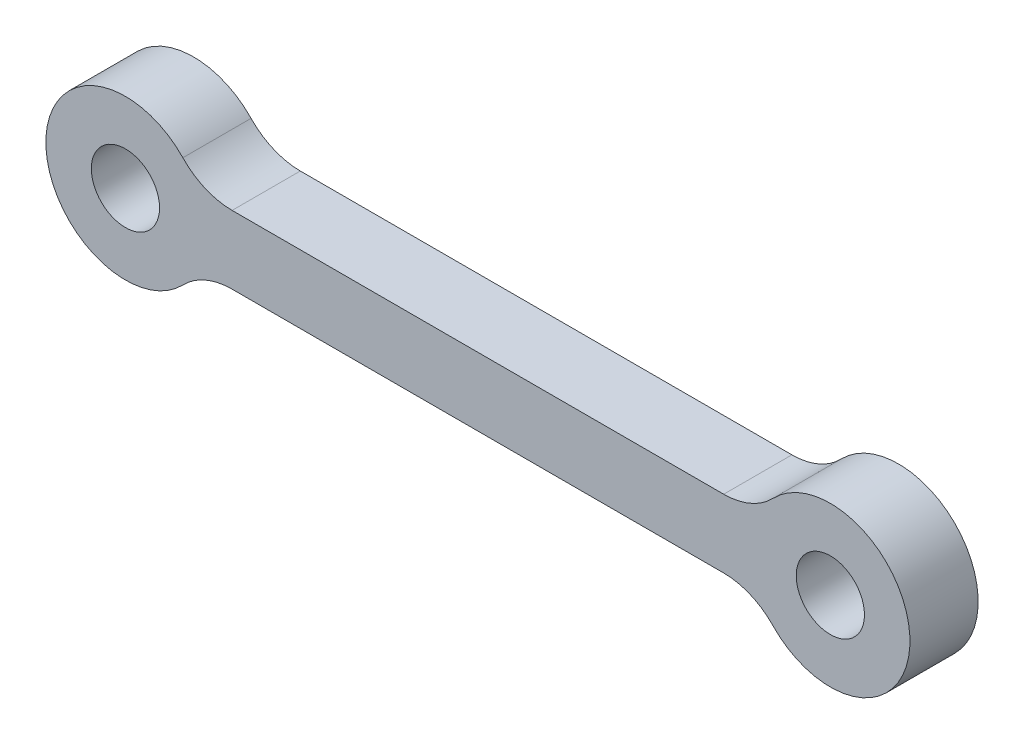
ISO-10303-21;
HEADER;
FILE_DESCRIPTION(('STEP AP214'),'2;1');
FILE_NAME('part.step','',(''),(''),'','','');
FILE_SCHEMA(('AUTOMOTIVE_DESIGN { 1 0 10303 214 1 1 1 1 }'));
ENDSEC;
DATA;
#1=APPLICATION_CONTEXT('core data for automotive mechanical design processes');
#2=APPLICATION_PROTOCOL_DEFINITION('international standard','automotive_design',2000,#1);
#3=PRODUCT_CONTEXT('',#1,'mechanical');
#4=PRODUCT('Part','Part','',(#3));
#5=PRODUCT_RELATED_PRODUCT_CATEGORY('part','',(#4));
#6=PRODUCT_DEFINITION_FORMATION('','',#4);
#7=PRODUCT_DEFINITION_CONTEXT('part definition',#1,'design');
#8=PRODUCT_DEFINITION('design','',#6,#7);
#9=PRODUCT_DEFINITION_SHAPE('','',#8);
#10=(LENGTH_UNIT() NAMED_UNIT(*) SI_UNIT(.MILLI.,.METRE.));
#11=(NAMED_UNIT(*) PLANE_ANGLE_UNIT() SI_UNIT($,.RADIAN.));
#12=(NAMED_UNIT(*) SI_UNIT($,.STERADIAN.) SOLID_ANGLE_UNIT());
#13=UNCERTAINTY_MEASURE_WITH_UNIT(LENGTH_MEASURE(1.E-05),#10,'distance_accuracy_value','');
#14=(GEOMETRIC_REPRESENTATION_CONTEXT(3) GLOBAL_UNCERTAINTY_ASSIGNED_CONTEXT((#13)) GLOBAL_UNIT_ASSIGNED_CONTEXT((#10,
#11,#12)) REPRESENTATION_CONTEXT('',''));
#15=CARTESIAN_POINT('',(0.,0.,0.));
#16=DIRECTION('',(0.,0.,1.));
#17=DIRECTION('',(1.,0.,0.));
#18=AXIS2_PLACEMENT_3D('',#15,#16,#17);
#19=CARTESIAN_POINT('',(26.3095842401766,-4.5,3.));
#20=DIRECTION('',(0.,0.,-1.));
#21=DIRECTION('',(-1.,0.,0.));
#22=AXIS2_PLACEMENT_3D('',#19,#20,#21);
#23=PLANE('',#22);
#24=CARTESIAN_POINT('',(26.3095842401766,-4.5,3.));
#25=DIRECTION('',(0.,0.,-1.));
#26=DIRECTION('',(-1.,0.,0.));
#27=AXIS2_PLACEMENT_3D('',#24,#25,#26);
#28=CIRCLE('',#27,3.);
#29=CARTESIAN_POINT('',(26.3095842401766,-1.5,3.));
#30=VERTEX_POINT('',#29);
#31=CARTESIAN_POINT('',(28.4743915139412,-2.42307692307692,3.));
#32=VERTEX_POINT('',#31);
#33=EDGE_CURVE('E147',#30,#32,#28,.T.);
#34=ORIENTED_EDGE('',*,*,#33,.T.);
#35=CARTESIAN_POINT('',(31.,0.,3.));
#36=DIRECTION('',(0.,0.,1.));
#37=DIRECTION('',(1.,0.,0.));
#38=AXIS2_PLACEMENT_3D('',#35,#36,#37);
#39=CIRCLE('',#38,3.5);
#40=CARTESIAN_POINT('',(28.4743915139412,2.42307692307692,3.));
#41=VERTEX_POINT('',#40);
#42=EDGE_CURVE('E95',#32,#41,#39,.T.);
#43=ORIENTED_EDGE('',*,*,#42,.T.);
#44=CARTESIAN_POINT('',(26.3095842401766,4.5,3.));
#45=DIRECTION('',(0.,0.,-1.));
#46=DIRECTION('',(1.,0.,0.));
#47=AXIS2_PLACEMENT_3D('',#44,#45,#46);
#48=CIRCLE('',#47,3.);
#49=CARTESIAN_POINT('',(26.3095842401766,1.5,3.));
#50=VERTEX_POINT('',#49);
#51=EDGE_CURVE('E162',#41,#50,#48,.T.);
#52=ORIENTED_EDGE('',*,*,#51,.T.);
#53=DIRECTION('',(-1.,0.,0.));
#54=VECTOR('',#53,1.);
#55=CARTESIAN_POINT('',(4.69041575982343,1.5,3.));
#56=LINE('',#55,#54);
#57=CARTESIAN_POINT('',(4.69041575982343,1.5,3.));
#58=VERTEX_POINT('',#57);
#59=EDGE_CURVE('E175',#50,#58,#56,.T.);
#60=ORIENTED_EDGE('',*,*,#59,.T.);
#61=CARTESIAN_POINT('',(4.69041575982343,4.5,3.));
#62=DIRECTION('',(0.,0.,-1.));
#63=DIRECTION('',(-1.,0.,0.));
#64=AXIS2_PLACEMENT_3D('',#61,#62,#63);
#65=CIRCLE('',#64,3.);
#66=CARTESIAN_POINT('',(2.52560848605877,2.42307692307692,3.));
#67=VERTEX_POINT('',#66);
#68=EDGE_CURVE('E114',#58,#67,#65,.T.);
#69=ORIENTED_EDGE('',*,*,#68,.T.);
#70=CARTESIAN_POINT('',(0.,0.,3.));
#71=DIRECTION('',(0.,0.,1.));
#72=DIRECTION('',(1.,0.,0.));
#73=AXIS2_PLACEMENT_3D('',#70,#71,#72);
#74=CIRCLE('',#73,3.5);
#75=CARTESIAN_POINT('',(2.52560848605877,-2.42307692307692,3.));
#76=VERTEX_POINT('',#75);
#77=EDGE_CURVE('E108',#67,#76,#74,.T.);
#78=ORIENTED_EDGE('',*,*,#77,.T.);
#79=CARTESIAN_POINT('',(4.69041575982343,-4.5,3.));
#80=DIRECTION('',(0.,0.,-1.));
#81=DIRECTION('',(1.,0.,0.));
#82=AXIS2_PLACEMENT_3D('',#79,#80,#81);
#83=CIRCLE('',#82,3.);
#84=CARTESIAN_POINT('',(4.69041575982343,-1.5,3.));
#85=VERTEX_POINT('',#84);
#86=EDGE_CURVE('E112',#76,#85,#83,.T.);
#87=ORIENTED_EDGE('',*,*,#86,.T.);
#88=DIRECTION('',(1.,0.,0.));
#89=VECTOR('',#88,1.);
#90=CARTESIAN_POINT('',(4.69041575982343,-1.5,3.));
#91=LINE('',#90,#89);
#92=EDGE_CURVE('E52',#85,#30,#91,.T.);
#93=ORIENTED_EDGE('',*,*,#92,.T.);
#94=EDGE_LOOP('',(#34,#43,#52,#60,#69,#78,#87,#93));
#95=FACE_BOUND('',#94,.T.);
#96=CARTESIAN_POINT('',(0.,0.,3.));
#97=DIRECTION('',(0.,0.,1.));
#98=DIRECTION('',(1.,0.,0.));
#99=AXIS2_PLACEMENT_3D('',#96,#97,#98);
#100=CIRCLE('',#99,1.5);
#101=CARTESIAN_POINT('',(1.5,0.,3.));
#102=VERTEX_POINT('',#101);
#103=EDGE_CURVE('E136',#102,#102,#100,.T.);
#104=ORIENTED_EDGE('',*,*,#103,.F.);
#105=EDGE_LOOP('',(#104));
#106=FACE_BOUND('',#105,.T.);
#107=CARTESIAN_POINT('',(31.,0.,3.));
#108=DIRECTION('',(0.,0.,1.));
#109=DIRECTION('',(1.,0.,0.));
#110=AXIS2_PLACEMENT_3D('',#107,#108,#109);
#111=CIRCLE('',#110,1.5);
#112=CARTESIAN_POINT('',(32.5,0.,3.));
#113=VERTEX_POINT('',#112);
#114=EDGE_CURVE('E184',#113,#113,#111,.T.);
#115=ORIENTED_EDGE('',*,*,#114,.F.);
#116=EDGE_LOOP('',(#115));
#117=FACE_BOUND('',#116,.T.);
#118=ADVANCED_FACE('F35',(#95,#106,#117),#23,.F.);
#119=CARTESIAN_POINT('',(26.3095842401766,-4.5,0.));
#120=DIRECTION('',(0.,0.,-1.));
#121=DIRECTION('',(-1.,0.,0.));
#122=AXIS2_PLACEMENT_3D('',#119,#120,#121);
#123=PLANE('',#122);
#124=CARTESIAN_POINT('',(0.,0.,0.));
#125=DIRECTION('',(0.,0.,1.));
#126=DIRECTION('',(1.,0.,0.));
#127=AXIS2_PLACEMENT_3D('',#124,#125,#126);
#128=CIRCLE('',#127,1.5);
#129=CARTESIAN_POINT('',(1.5,0.,0.));
#130=VERTEX_POINT('',#129);
#131=EDGE_CURVE('E181',#130,#130,#128,.T.);
#132=ORIENTED_EDGE('',*,*,#131,.T.);
#133=EDGE_LOOP('',(#132));
#134=FACE_BOUND('',#133,.T.);
#135=CARTESIAN_POINT('',(26.3095842401766,-4.5,0.));
#136=DIRECTION('',(0.,0.,-1.));
#137=DIRECTION('',(-1.,0.,0.));
#138=AXIS2_PLACEMENT_3D('',#135,#136,#137);
#139=CIRCLE('',#138,3.);
#140=CARTESIAN_POINT('',(26.3095842401766,-1.5,0.));
#141=VERTEX_POINT('',#140);
#142=CARTESIAN_POINT('',(28.4743915139412,-2.42307692307692,0.));
#143=VERTEX_POINT('',#142);
#144=EDGE_CURVE('E132',#141,#143,#139,.T.);
#145=ORIENTED_EDGE('',*,*,#144,.F.);
#146=DIRECTION('',(1.,0.,0.));
#147=VECTOR('',#146,1.);
#148=CARTESIAN_POINT('',(4.69041575982343,-1.5,0.));
#149=LINE('',#148,#147);
#150=CARTESIAN_POINT('',(4.69041575982343,-1.5,0.));
#151=VERTEX_POINT('',#150);
#152=EDGE_CURVE('E87',#151,#141,#149,.T.);
#153=ORIENTED_EDGE('',*,*,#152,.F.);
#154=CARTESIAN_POINT('',(4.69041575982343,-4.5,0.));
#155=DIRECTION('',(0.,0.,-1.));
#156=DIRECTION('',(1.,0.,0.));
#157=AXIS2_PLACEMENT_3D('',#154,#155,#156);
#158=CIRCLE('',#157,3.);
#159=CARTESIAN_POINT('',(2.52560848605877,-2.42307692307692,0.));
#160=VERTEX_POINT('',#159);
#161=EDGE_CURVE('E81',#160,#151,#158,.T.);
#162=ORIENTED_EDGE('',*,*,#161,.F.);
#163=CARTESIAN_POINT('',(0.,0.,0.));
#164=DIRECTION('',(0.,0.,1.));
#165=DIRECTION('',(1.,0.,0.));
#166=AXIS2_PLACEMENT_3D('',#163,#164,#165);
#167=CIRCLE('',#166,3.5);
#168=CARTESIAN_POINT('',(2.52560848605877,2.42307692307692,0.));
#169=VERTEX_POINT('',#168);
#170=EDGE_CURVE('E122',#169,#160,#167,.T.);
#171=ORIENTED_EDGE('',*,*,#170,.F.);
#172=CARTESIAN_POINT('',(4.69041575982343,4.5,0.));
#173=DIRECTION('',(0.,0.,-1.));
#174=DIRECTION('',(-1.,0.,0.));
#175=AXIS2_PLACEMENT_3D('',#172,#173,#174);
#176=CIRCLE('',#175,3.);
#177=CARTESIAN_POINT('',(4.69041575982343,1.5,0.));
#178=VERTEX_POINT('',#177);
#179=EDGE_CURVE('E142',#178,#169,#176,.T.);
#180=ORIENTED_EDGE('',*,*,#179,.F.);
#181=DIRECTION('',(-1.,0.,0.));
#182=VECTOR('',#181,1.);
#183=CARTESIAN_POINT('',(4.69041575982343,1.5,0.));
#184=LINE('',#183,#182);
#185=CARTESIAN_POINT('',(26.3095842401766,1.5,0.));
#186=VERTEX_POINT('',#185);
#187=EDGE_CURVE('E140',#186,#178,#184,.T.);
#188=ORIENTED_EDGE('',*,*,#187,.F.);
#189=CARTESIAN_POINT('',(26.3095842401766,4.5,0.));
#190=DIRECTION('',(0.,0.,-1.));
#191=DIRECTION('',(1.,0.,0.));
#192=AXIS2_PLACEMENT_3D('',#189,#190,#191);
#193=CIRCLE('',#192,3.);
#194=CARTESIAN_POINT('',(28.4743915139412,2.42307692307692,0.));
#195=VERTEX_POINT('',#194);
#196=EDGE_CURVE('E138',#195,#186,#193,.T.);
#197=ORIENTED_EDGE('',*,*,#196,.F.);
#198=CARTESIAN_POINT('',(31.,0.,0.));
#199=DIRECTION('',(0.,0.,1.));
#200=DIRECTION('',(1.,0.,0.));
#201=AXIS2_PLACEMENT_3D('',#198,#199,#200);
#202=CIRCLE('',#201,3.5);
#203=EDGE_CURVE('E135',#143,#195,#202,.T.);
#204=ORIENTED_EDGE('',*,*,#203,.F.);
#205=EDGE_LOOP('',(#145,#153,#162,#171,#180,#188,#197,#204));
#206=FACE_BOUND('',#205,.T.);
#207=CARTESIAN_POINT('',(31.,0.,0.));
#208=DIRECTION('',(0.,0.,1.));
#209=DIRECTION('',(1.,0.,0.));
#210=AXIS2_PLACEMENT_3D('',#207,#208,#209);
#211=CIRCLE('',#210,1.5);
#212=CARTESIAN_POINT('',(32.5,0.,0.));
#213=VERTEX_POINT('',#212);
#214=EDGE_CURVE('E187',#213,#213,#211,.T.);
#215=ORIENTED_EDGE('',*,*,#214,.T.);
#216=EDGE_LOOP('',(#215));
#217=FACE_BOUND('',#216,.T.);
#218=ADVANCED_FACE('F166',(#134,#206,#217),#123,.T.);
#219=CARTESIAN_POINT('',(26.3095842401766,-4.5,3.));
#220=DIRECTION('',(0.,0.,-1.));
#221=DIRECTION('',(-1.,0.,0.));
#222=AXIS2_PLACEMENT_3D('',#219,#220,#221);
#223=CYLINDRICAL_SURFACE('',#222,3.);
#224=ORIENTED_EDGE('',*,*,#144,.T.);
#225=DIRECTION('',(0.,0.,-1.));
#226=VECTOR('',#225,1.);
#227=CARTESIAN_POINT('',(28.4743915139412,-2.42307692307692,3.));
#228=LINE('',#227,#226);
#229=EDGE_CURVE('E11',#32,#143,#228,.T.);
#230=ORIENTED_EDGE('',*,*,#229,.F.);
#231=ORIENTED_EDGE('',*,*,#33,.F.);
#232=DIRECTION('',(0.,0.,-1.));
#233=VECTOR('',#232,1.);
#234=CARTESIAN_POINT('',(26.3095842401766,-1.5,3.));
#235=LINE('',#234,#233);
#236=EDGE_CURVE('E128',#30,#141,#235,.T.);
#237=ORIENTED_EDGE('',*,*,#236,.T.);
#238=EDGE_LOOP('',(#224,#230,#231,#237));
#239=FACE_BOUND('',#238,.T.);
#240=ADVANCED_FACE('F37',(#239),#223,.F.);
#241=CARTESIAN_POINT('',(31.,0.,3.));
#242=DIRECTION('',(0.,0.,-1.));
#243=DIRECTION('',(-1.,0.,0.));
#244=AXIS2_PLACEMENT_3D('',#241,#242,#243);
#245=CYLINDRICAL_SURFACE('',#244,3.5);
#246=ORIENTED_EDGE('',*,*,#203,.T.);
#247=DIRECTION('',(0.,0.,-1.));
#248=VECTOR('',#247,1.);
#249=CARTESIAN_POINT('',(28.4743915139412,2.42307692307692,3.));
#250=LINE('',#249,#248);
#251=EDGE_CURVE('E44',#41,#195,#250,.T.);
#252=ORIENTED_EDGE('',*,*,#251,.F.);
#253=ORIENTED_EDGE('',*,*,#42,.F.);
#254=ORIENTED_EDGE('',*,*,#229,.T.);
#255=EDGE_LOOP('',(#246,#252,#253,#254));
#256=FACE_BOUND('',#255,.T.);
#257=ADVANCED_FACE('F219',(#256),#245,.T.);
#258=CARTESIAN_POINT('',(26.3095842401766,4.5,3.));
#259=DIRECTION('',(0.,0.,-1.));
#260=DIRECTION('',(-1.,0.,0.));
#261=AXIS2_PLACEMENT_3D('',#258,#259,#260);
#262=CYLINDRICAL_SURFACE('',#261,3.);
#263=ORIENTED_EDGE('',*,*,#196,.T.);
#264=DIRECTION('',(0.,0.,-1.));
#265=VECTOR('',#264,1.);
#266=CARTESIAN_POINT('',(26.3095842401766,1.5,3.));
#267=LINE('',#266,#265);
#268=EDGE_CURVE('E154',#50,#186,#267,.T.);
#269=ORIENTED_EDGE('',*,*,#268,.F.);
#270=ORIENTED_EDGE('',*,*,#51,.F.);
#271=ORIENTED_EDGE('',*,*,#251,.T.);
#272=EDGE_LOOP('',(#263,#269,#270,#271));
#273=FACE_BOUND('',#272,.T.);
#274=ADVANCED_FACE('F160',(#273),#262,.F.);
#275=CARTESIAN_POINT('',(4.69041575982343,1.5,3.));
#276=DIRECTION('',(0.,-1.,0.));
#277=DIRECTION('',(0.,0.,-1.));
#278=AXIS2_PLACEMENT_3D('',#275,#276,#277);
#279=PLANE('',#278);
#280=ORIENTED_EDGE('',*,*,#187,.T.);
#281=DIRECTION('',(0.,0.,-1.));
#282=VECTOR('',#281,1.);
#283=CARTESIAN_POINT('',(4.69041575982343,1.5,3.));
#284=LINE('',#283,#282);
#285=EDGE_CURVE('E151',#58,#178,#284,.T.);
#286=ORIENTED_EDGE('',*,*,#285,.F.);
#287=ORIENTED_EDGE('',*,*,#59,.F.);
#288=ORIENTED_EDGE('',*,*,#268,.T.);
#289=EDGE_LOOP('',(#280,#286,#287,#288));
#290=FACE_BOUND('',#289,.T.);
#291=ADVANCED_FACE('F171',(#290),#279,.F.);
#292=CARTESIAN_POINT('',(4.69041575982343,4.5,3.));
#293=DIRECTION('',(0.,0.,-1.));
#294=DIRECTION('',(-1.,0.,0.));
#295=AXIS2_PLACEMENT_3D('',#292,#293,#294);
#296=CYLINDRICAL_SURFACE('',#295,3.);
#297=ORIENTED_EDGE('',*,*,#179,.T.);
#298=DIRECTION('',(0.,0.,-1.));
#299=VECTOR('',#298,1.);
#300=CARTESIAN_POINT('',(2.52560848605877,2.42307692307692,3.));
#301=LINE('',#300,#299);
#302=EDGE_CURVE('E123',#67,#169,#301,.T.);
#303=ORIENTED_EDGE('',*,*,#302,.F.);
#304=ORIENTED_EDGE('',*,*,#68,.F.);
#305=ORIENTED_EDGE('',*,*,#285,.T.);
#306=EDGE_LOOP('',(#297,#303,#304,#305));
#307=FACE_BOUND('',#306,.T.);
#308=ADVANCED_FACE('F174',(#307),#296,.F.);
#309=CARTESIAN_POINT('',(0.,0.,3.));
#310=DIRECTION('',(0.,0.,-1.));
#311=DIRECTION('',(-1.,0.,0.));
#312=AXIS2_PLACEMENT_3D('',#309,#310,#311);
#313=CYLINDRICAL_SURFACE('',#312,3.5);
#314=ORIENTED_EDGE('',*,*,#170,.T.);
#315=DIRECTION('',(0.,0.,-1.));
#316=VECTOR('',#315,1.);
#317=CARTESIAN_POINT('',(2.52560848605877,-2.42307692307692,3.));
#318=LINE('',#317,#316);
#319=EDGE_CURVE('E119',#76,#160,#318,.T.);
#320=ORIENTED_EDGE('',*,*,#319,.F.);
#321=ORIENTED_EDGE('',*,*,#77,.F.);
#322=ORIENTED_EDGE('',*,*,#302,.T.);
#323=EDGE_LOOP('',(#314,#320,#321,#322));
#324=FACE_BOUND('',#323,.T.);
#325=ADVANCED_FACE('F120',(#324),#313,.T.);
#326=CARTESIAN_POINT('',(4.69041575982343,-4.5,3.));
#327=DIRECTION('',(0.,0.,-1.));
#328=DIRECTION('',(-1.,0.,0.));
#329=AXIS2_PLACEMENT_3D('',#326,#327,#328);
#330=CYLINDRICAL_SURFACE('',#329,3.);
#331=ORIENTED_EDGE('',*,*,#161,.T.);
#332=DIRECTION('',(0.,0.,-1.));
#333=VECTOR('',#332,1.);
#334=CARTESIAN_POINT('',(4.69041575982343,-1.5,3.));
#335=LINE('',#334,#333);
#336=EDGE_CURVE('E124',#85,#151,#335,.T.);
#337=ORIENTED_EDGE('',*,*,#336,.F.);
#338=ORIENTED_EDGE('',*,*,#86,.F.);
#339=ORIENTED_EDGE('',*,*,#319,.T.);
#340=EDGE_LOOP('',(#331,#337,#338,#339));
#341=FACE_BOUND('',#340,.T.);
#342=ADVANCED_FACE('F126',(#341),#330,.F.);
#343=CARTESIAN_POINT('',(4.69041575982343,-1.5,3.));
#344=DIRECTION('',(0.,1.,0.));
#345=DIRECTION('',(0.,0.,1.));
#346=AXIS2_PLACEMENT_3D('',#343,#344,#345);
#347=PLANE('',#346);
#348=ORIENTED_EDGE('',*,*,#152,.T.);
#349=ORIENTED_EDGE('',*,*,#236,.F.);
#350=ORIENTED_EDGE('',*,*,#92,.F.);
#351=ORIENTED_EDGE('',*,*,#336,.T.);
#352=EDGE_LOOP('',(#348,#349,#350,#351));
#353=FACE_BOUND('',#352,.T.);
#354=ADVANCED_FACE('F207',(#353),#347,.F.);
#355=CARTESIAN_POINT('',(0.,0.,3.));
#356=DIRECTION('',(0.,0.,-1.));
#357=DIRECTION('',(-1.,0.,0.));
#358=AXIS2_PLACEMENT_3D('',#355,#356,#357);
#359=CYLINDRICAL_SURFACE('',#358,1.5);
#360=ORIENTED_EDGE('',*,*,#103,.T.);
#361=EDGE_LOOP('',(#360));
#362=FACE_BOUND('',#361,.T.);
#363=ORIENTED_EDGE('',*,*,#131,.F.);
#364=EDGE_LOOP('',(#363));
#365=FACE_BOUND('',#364,.T.);
#366=ADVANCED_FACE('F204',(#362,#365),#359,.F.);
#367=CARTESIAN_POINT('',(31.,0.,3.));
#368=DIRECTION('',(0.,0.,-1.));
#369=DIRECTION('',(-1.,0.,0.));
#370=AXIS2_PLACEMENT_3D('',#367,#368,#369);
#371=CYLINDRICAL_SURFACE('',#370,1.5);
#372=ORIENTED_EDGE('',*,*,#114,.T.);
#373=EDGE_LOOP('',(#372));
#374=FACE_BOUND('',#373,.T.);
#375=ORIENTED_EDGE('',*,*,#214,.F.);
#376=EDGE_LOOP('',(#375));
#377=FACE_BOUND('',#376,.T.);
#378=ADVANCED_FACE('F193',(#374,#377),#371,.F.);
#379=CLOSED_SHELL('',(#118,#218,#240,#257,#274,#291,#308,#325,#342,#354,#366,#378));
#380=MANIFOLD_SOLID_BREP('B2',#379);
#381=ADVANCED_BREP_SHAPE_REPRESENTATION('',(#18,#380),#14);
#382=SHAPE_DEFINITION_REPRESENTATION(#9,#381);
ENDSEC;
END-ISO-10303-21;
